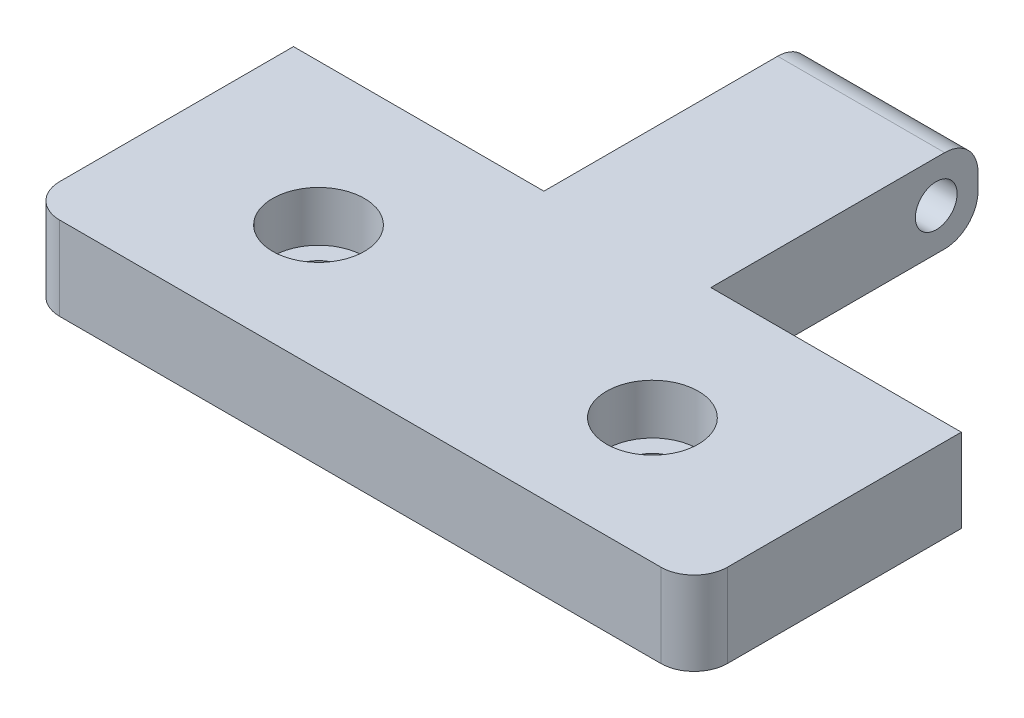
ISO-10303-21;
HEADER;
FILE_DESCRIPTION(('STEP AP214'),'2;1');
FILE_NAME('part.step','',(''),(''),'','','');
FILE_SCHEMA(('AUTOMOTIVE_DESIGN { 1 0 10303 214 1 1 1 1 }'));
ENDSEC;
DATA;
#1=APPLICATION_CONTEXT('core data for automotive mechanical design processes');
#2=APPLICATION_PROTOCOL_DEFINITION('international standard','automotive_design',2000,#1);
#3=PRODUCT_CONTEXT('',#1,'mechanical');
#4=PRODUCT('Part','Part','',(#3));
#5=PRODUCT_RELATED_PRODUCT_CATEGORY('part','',(#4));
#6=PRODUCT_DEFINITION_FORMATION('','',#4);
#7=PRODUCT_DEFINITION_CONTEXT('part definition',#1,'design');
#8=PRODUCT_DEFINITION('design','',#6,#7);
#9=PRODUCT_DEFINITION_SHAPE('','',#8);
#10=(LENGTH_UNIT() NAMED_UNIT(*) SI_UNIT(.MILLI.,.METRE.));
#11=(NAMED_UNIT(*) PLANE_ANGLE_UNIT() SI_UNIT($,.RADIAN.));
#12=(NAMED_UNIT(*) SI_UNIT($,.STERADIAN.) SOLID_ANGLE_UNIT());
#13=UNCERTAINTY_MEASURE_WITH_UNIT(LENGTH_MEASURE(1.E-05),#10,'distance_accuracy_value','');
#14=(GEOMETRIC_REPRESENTATION_CONTEXT(3) GLOBAL_UNCERTAINTY_ASSIGNED_CONTEXT((#13)) GLOBAL_UNIT_ASSIGNED_CONTEXT((#10,
#11,#12)) REPRESENTATION_CONTEXT('',''));
#15=CARTESIAN_POINT('',(0.,0.,0.));
#16=DIRECTION('',(0.,0.,1.));
#17=DIRECTION('',(1.,0.,0.));
#18=AXIS2_PLACEMENT_3D('',#15,#16,#17);
#19=CARTESIAN_POINT('',(0.,10.,0.));
#20=DIRECTION('',(1.,0.,0.));
#21=DIRECTION('',(0.,0.,-1.));
#22=AXIS2_PLACEMENT_3D('',#19,#20,#21);
#23=PLANE('',#22);
#24=DIRECTION('',(0.,0.,1.));
#25=VECTOR('',#24,1.);
#26=CARTESIAN_POINT('',(0.,0.,0.));
#27=LINE('',#26,#25);
#28=CARTESIAN_POINT('',(0.,0.,-32.));
#29=VERTEX_POINT('',#28);
#30=CARTESIAN_POINT('',(0.,0.,-4.));
#31=VERTEX_POINT('',#30);
#32=EDGE_CURVE('E164',#29,#31,#27,.T.);
#33=ORIENTED_EDGE('',*,*,#32,.T.);
#34=DIRECTION('',(0.,-1.,0.));
#35=VECTOR('',#34,1.);
#36=CARTESIAN_POINT('',(0.,10.,-4.));
#37=LINE('',#36,#35);
#38=CARTESIAN_POINT('',(0.,10.,-4.));
#39=VERTEX_POINT('',#38);
#40=EDGE_CURVE('E64',#31,#39,#37,.F.);
#41=ORIENTED_EDGE('',*,*,#40,.T.);
#42=DIRECTION('',(0.,0.,1.));
#43=VECTOR('',#42,1.);
#44=CARTESIAN_POINT('',(0.,10.,0.));
#45=LINE('',#44,#43);
#46=CARTESIAN_POINT('',(0.,10.,-32.));
#47=VERTEX_POINT('',#46);
#48=EDGE_CURVE('E180',#47,#39,#45,.T.);
#49=ORIENTED_EDGE('',*,*,#48,.F.);
#50=DIRECTION('',(0.,-1.,0.));
#51=VECTOR('',#50,1.);
#52=CARTESIAN_POINT('',(0.,10.,-32.));
#53=LINE('',#52,#51);
#54=EDGE_CURVE('E163',#47,#29,#53,.T.);
#55=ORIENTED_EDGE('',*,*,#54,.T.);
#56=EDGE_LOOP('',(#33,#41,#49,#55));
#57=FACE_BOUND('',#56,.T.);
#58=ADVANCED_FACE('F41',(#57),#23,.F.);
#59=CARTESIAN_POINT('',(0.,10.,0.));
#60=DIRECTION('',(0.,0.,-1.));
#61=DIRECTION('',(-1.,0.,0.));
#62=AXIS2_PLACEMENT_3D('',#59,#60,#61);
#63=PLANE('',#62);
#64=DIRECTION('',(1.,0.,0.));
#65=VECTOR('',#64,1.);
#66=CARTESIAN_POINT('',(0.,10.,0.));
#67=LINE('',#66,#65);
#68=CARTESIAN_POINT('',(4.,10.,0.));
#69=VERTEX_POINT('',#68);
#70=CARTESIAN_POINT('',(76.,10.,0.));
#71=VERTEX_POINT('',#70);
#72=EDGE_CURVE('E139',#69,#71,#67,.T.);
#73=ORIENTED_EDGE('',*,*,#72,.F.);
#74=DIRECTION('',(0.,-1.,0.));
#75=VECTOR('',#74,1.);
#76=CARTESIAN_POINT('',(4.,10.,0.));
#77=LINE('',#76,#75);
#78=CARTESIAN_POINT('',(4.,0.,0.));
#79=VERTEX_POINT('',#78);
#80=EDGE_CURVE('E215',#69,#79,#77,.T.);
#81=ORIENTED_EDGE('',*,*,#80,.T.);
#82=DIRECTION('',(1.,0.,0.));
#83=VECTOR('',#82,1.);
#84=CARTESIAN_POINT('',(0.,0.,0.));
#85=LINE('',#84,#83);
#86=CARTESIAN_POINT('',(76.,0.,0.));
#87=VERTEX_POINT('',#86);
#88=EDGE_CURVE('E166',#79,#87,#85,.T.);
#89=ORIENTED_EDGE('',*,*,#88,.T.);
#90=DIRECTION('',(0.,-1.,0.));
#91=VECTOR('',#90,1.);
#92=CARTESIAN_POINT('',(76.,10.,0.));
#93=LINE('',#92,#91);
#94=EDGE_CURVE('E210',#87,#71,#93,.F.);
#95=ORIENTED_EDGE('',*,*,#94,.T.);
#96=EDGE_LOOP('',(#73,#81,#89,#95));
#97=FACE_BOUND('',#96,.T.);
#98=ADVANCED_FACE('F228',(#97),#63,.F.);
#99=CARTESIAN_POINT('',(80.,10.,0.));
#100=DIRECTION('',(-1.,0.,0.));
#101=DIRECTION('',(0.,0.,1.));
#102=AXIS2_PLACEMENT_3D('',#99,#100,#101);
#103=PLANE('',#102);
#104=DIRECTION('',(0.,0.,-1.));
#105=VECTOR('',#104,1.);
#106=CARTESIAN_POINT('',(80.,10.,0.));
#107=LINE('',#106,#105);
#108=CARTESIAN_POINT('',(80.,10.,-4.));
#109=VERTEX_POINT('',#108);
#110=CARTESIAN_POINT('',(80.,10.,-32.));
#111=VERTEX_POINT('',#110);
#112=EDGE_CURVE('E130',#109,#111,#107,.T.);
#113=ORIENTED_EDGE('',*,*,#112,.F.);
#114=DIRECTION('',(0.,-1.,0.));
#115=VECTOR('',#114,1.);
#116=CARTESIAN_POINT('',(80.,10.,-4.));
#117=LINE('',#116,#115);
#118=CARTESIAN_POINT('',(80.,0.,-4.));
#119=VERTEX_POINT('',#118);
#120=EDGE_CURVE('E11',#109,#119,#117,.T.);
#121=ORIENTED_EDGE('',*,*,#120,.T.);
#122=DIRECTION('',(0.,0.,-1.));
#123=VECTOR('',#122,1.);
#124=CARTESIAN_POINT('',(80.,0.,0.));
#125=LINE('',#124,#123);
#126=CARTESIAN_POINT('',(80.,0.,-32.));
#127=VERTEX_POINT('',#126);
#128=EDGE_CURVE('E145',#119,#127,#125,.T.);
#129=ORIENTED_EDGE('',*,*,#128,.T.);
#130=DIRECTION('',(0.,-1.,0.));
#131=VECTOR('',#130,1.);
#132=CARTESIAN_POINT('',(80.,10.,-32.));
#133=LINE('',#132,#131);
#134=EDGE_CURVE('E142',#111,#127,#133,.T.);
#135=ORIENTED_EDGE('',*,*,#134,.F.);
#136=EDGE_LOOP('',(#113,#121,#129,#135));
#137=FACE_BOUND('',#136,.T.);
#138=ADVANCED_FACE('F143',(#137),#103,.F.);
#139=CARTESIAN_POINT('',(50.,10.,-32.));
#140=DIRECTION('',(0.,0.,1.));
#141=DIRECTION('',(1.,0.,0.));
#142=AXIS2_PLACEMENT_3D('',#139,#140,#141);
#143=PLANE('',#142);
#144=DIRECTION('',(-1.,0.,0.));
#145=VECTOR('',#144,1.);
#146=CARTESIAN_POINT('',(50.,0.,-32.));
#147=LINE('',#146,#145);
#148=CARTESIAN_POINT('',(50.,0.,-32.));
#149=VERTEX_POINT('',#148);
#150=EDGE_CURVE('E171',#127,#149,#147,.T.);
#151=ORIENTED_EDGE('',*,*,#150,.T.);
#152=DIRECTION('',(0.,-1.,0.));
#153=VECTOR('',#152,1.);
#154=CARTESIAN_POINT('',(50.,10.,-32.));
#155=LINE('',#154,#153);
#156=CARTESIAN_POINT('',(50.,10.,-32.));
#157=VERTEX_POINT('',#156);
#158=EDGE_CURVE('E149',#157,#149,#155,.T.);
#159=ORIENTED_EDGE('',*,*,#158,.F.);
#160=DIRECTION('',(-1.,0.,0.));
#161=VECTOR('',#160,1.);
#162=CARTESIAN_POINT('',(50.,10.,-32.));
#163=LINE('',#162,#161);
#164=EDGE_CURVE('E135',#111,#157,#163,.T.);
#165=ORIENTED_EDGE('',*,*,#164,.F.);
#166=ORIENTED_EDGE('',*,*,#134,.T.);
#167=EDGE_LOOP('',(#151,#159,#165,#166));
#168=FACE_BOUND('',#167,.T.);
#169=ADVANCED_FACE('F151',(#168),#143,.F.);
#170=CARTESIAN_POINT('',(50.,10.,-32.));
#171=DIRECTION('',(-1.,0.,0.));
#172=DIRECTION('',(0.,0.,1.));
#173=AXIS2_PLACEMENT_3D('',#170,#171,#172);
#174=PLANE('',#173);
#175=CARTESIAN_POINT('',(50.,5.,-59.));
#176=DIRECTION('',(1.,0.,0.));
#177=DIRECTION('',(0.,0.,-1.));
#178=AXIS2_PLACEMENT_3D('',#175,#176,#177);
#179=CIRCLE('',#178,2.5);
#180=CARTESIAN_POINT('',(50.,5.,-61.5));
#181=VERTEX_POINT('',#180);
#182=EDGE_CURVE('E213',#181,#181,#179,.T.);
#183=ORIENTED_EDGE('',*,*,#182,.F.);
#184=EDGE_LOOP('',(#183));
#185=FACE_BOUND('',#184,.T.);
#186=DIRECTION('',(0.,0.,-1.));
#187=VECTOR('',#186,1.);
#188=CARTESIAN_POINT('',(50.,0.,-32.));
#189=LINE('',#188,#187);
#190=CARTESIAN_POINT('',(50.,0.,-60.));
#191=VERTEX_POINT('',#190);
#192=EDGE_CURVE('E173',#149,#191,#189,.T.);
#193=ORIENTED_EDGE('',*,*,#192,.T.);
#194=CARTESIAN_POINT('',(50.,4.,-60.));
#195=DIRECTION('',(-1.,0.,0.));
#196=DIRECTION('',(0.,0.,1.));
#197=AXIS2_PLACEMENT_3D('',#194,#195,#196);
#198=CIRCLE('',#197,4.);
#199=CARTESIAN_POINT('',(50.,4.,-64.));
#200=VERTEX_POINT('',#199);
#201=EDGE_CURVE('E205',#191,#200,#198,.F.);
#202=ORIENTED_EDGE('',*,*,#201,.T.);
#203=DIRECTION('',(0.,-1.,0.));
#204=VECTOR('',#203,1.);
#205=CARTESIAN_POINT('',(50.,10.,-64.));
#206=LINE('',#205,#204);
#207=CARTESIAN_POINT('',(50.,6.,-64.));
#208=VERTEX_POINT('',#207);
#209=EDGE_CURVE('E189',#208,#200,#206,.T.);
#210=ORIENTED_EDGE('',*,*,#209,.F.);
#211=CARTESIAN_POINT('',(50.,6.,-60.));
#212=DIRECTION('',(-1.,0.,0.));
#213=DIRECTION('',(0.,0.,1.));
#214=AXIS2_PLACEMENT_3D('',#211,#212,#213);
#215=CIRCLE('',#214,4.);
#216=CARTESIAN_POINT('',(50.,10.,-60.));
#217=VERTEX_POINT('',#216);
#218=EDGE_CURVE('E203',#208,#217,#215,.F.);
#219=ORIENTED_EDGE('',*,*,#218,.T.);
#220=DIRECTION('',(0.,0.,-1.));
#221=VECTOR('',#220,1.);
#222=CARTESIAN_POINT('',(50.,10.,-32.));
#223=LINE('',#222,#221);
#224=EDGE_CURVE('E154',#157,#217,#223,.T.);
#225=ORIENTED_EDGE('',*,*,#224,.F.);
#226=ORIENTED_EDGE('',*,*,#158,.T.);
#227=EDGE_LOOP('',(#193,#202,#210,#219,#225,#226));
#228=FACE_BOUND('',#227,.T.);
#229=ADVANCED_FACE('F251',(#185,#228),#174,.F.);
#230=CARTESIAN_POINT('',(30.,10.,-64.));
#231=DIRECTION('',(0.,0.,1.));
#232=DIRECTION('',(1.,0.,0.));
#233=AXIS2_PLACEMENT_3D('',#230,#231,#232);
#234=PLANE('',#233);
#235=ORIENTED_EDGE('',*,*,#209,.T.);
#236=DIRECTION('',(-1.,0.,0.));
#237=VECTOR('',#236,1.);
#238=CARTESIAN_POINT('',(30.,4.,-64.));
#239=LINE('',#238,#237);
#240=CARTESIAN_POINT('',(30.,4.,-64.));
#241=VERTEX_POINT('',#240);
#242=EDGE_CURVE('E194',#200,#241,#239,.T.);
#243=ORIENTED_EDGE('',*,*,#242,.T.);
#244=DIRECTION('',(0.,-1.,0.));
#245=VECTOR('',#244,1.);
#246=CARTESIAN_POINT('',(30.,10.,-64.));
#247=LINE('',#246,#245);
#248=CARTESIAN_POINT('',(30.,6.,-64.));
#249=VERTEX_POINT('',#248);
#250=EDGE_CURVE('E186',#249,#241,#247,.T.);
#251=ORIENTED_EDGE('',*,*,#250,.F.);
#252=DIRECTION('',(-1.,0.,0.));
#253=VECTOR('',#252,1.);
#254=CARTESIAN_POINT('',(30.,6.,-64.));
#255=LINE('',#254,#253);
#256=EDGE_CURVE('E148',#249,#208,#255,.F.);
#257=ORIENTED_EDGE('',*,*,#256,.T.);
#258=EDGE_LOOP('',(#235,#243,#251,#257));
#259=FACE_BOUND('',#258,.T.);
#260=ADVANCED_FACE('F254',(#259),#234,.F.);
#261=CARTESIAN_POINT('',(30.,10.,-32.));
#262=DIRECTION('',(1.,0.,0.));
#263=DIRECTION('',(0.,0.,-1.));
#264=AXIS2_PLACEMENT_3D('',#261,#262,#263);
#265=PLANE('',#264);
#266=CARTESIAN_POINT('',(30.,5.,-59.));
#267=DIRECTION('',(1.,0.,0.));
#268=DIRECTION('',(0.,0.,-1.));
#269=AXIS2_PLACEMENT_3D('',#266,#267,#268);
#270=CIRCLE('',#269,2.5);
#271=CARTESIAN_POINT('',(30.,5.,-61.5));
#272=VERTEX_POINT('',#271);
#273=EDGE_CURVE('E167',#272,#272,#270,.T.);
#274=ORIENTED_EDGE('',*,*,#273,.T.);
#275=EDGE_LOOP('',(#274));
#276=FACE_BOUND('',#275,.T.);
#277=ORIENTED_EDGE('',*,*,#250,.T.);
#278=CARTESIAN_POINT('',(30.,4.,-60.));
#279=DIRECTION('',(1.,0.,0.));
#280=DIRECTION('',(0.,0.,-1.));
#281=AXIS2_PLACEMENT_3D('',#278,#279,#280);
#282=CIRCLE('',#281,4.);
#283=CARTESIAN_POINT('',(30.,0.,-60.));
#284=VERTEX_POINT('',#283);
#285=EDGE_CURVE('E199',#241,#284,#282,.F.);
#286=ORIENTED_EDGE('',*,*,#285,.T.);
#287=DIRECTION('',(0.,0.,1.));
#288=VECTOR('',#287,1.);
#289=CARTESIAN_POINT('',(30.,0.,-32.));
#290=LINE('',#289,#288);
#291=CARTESIAN_POINT('',(30.,0.,-32.));
#292=VERTEX_POINT('',#291);
#293=EDGE_CURVE('E176',#284,#292,#290,.T.);
#294=ORIENTED_EDGE('',*,*,#293,.T.);
#295=DIRECTION('',(0.,-1.,0.));
#296=VECTOR('',#295,1.);
#297=CARTESIAN_POINT('',(30.,10.,-32.));
#298=LINE('',#297,#296);
#299=CARTESIAN_POINT('',(30.,10.,-32.));
#300=VERTEX_POINT('',#299);
#301=EDGE_CURVE('E183',#300,#292,#298,.T.);
#302=ORIENTED_EDGE('',*,*,#301,.F.);
#303=DIRECTION('',(0.,0.,1.));
#304=VECTOR('',#303,1.);
#305=CARTESIAN_POINT('',(30.,10.,-32.));
#306=LINE('',#305,#304);
#307=CARTESIAN_POINT('',(30.,10.,-60.));
#308=VERTEX_POINT('',#307);
#309=EDGE_CURVE('E156',#308,#300,#306,.T.);
#310=ORIENTED_EDGE('',*,*,#309,.F.);
#311=CARTESIAN_POINT('',(30.,6.,-60.));
#312=DIRECTION('',(1.,0.,0.));
#313=DIRECTION('',(0.,0.,-1.));
#314=AXIS2_PLACEMENT_3D('',#311,#312,#313);
#315=CIRCLE('',#314,4.);
#316=EDGE_CURVE('E197',#308,#249,#315,.F.);
#317=ORIENTED_EDGE('',*,*,#316,.T.);
#318=EDGE_LOOP('',(#277,#286,#294,#302,#310,#317));
#319=FACE_BOUND('',#318,.T.);
#320=ADVANCED_FACE('F261',(#276,#319),#265,.F.);
#321=CARTESIAN_POINT('',(0.,10.,-32.));
#322=DIRECTION('',(0.,0.,1.));
#323=DIRECTION('',(1.,0.,0.));
#324=AXIS2_PLACEMENT_3D('',#321,#322,#323);
#325=PLANE('',#324);
#326=DIRECTION('',(-1.,0.,0.));
#327=VECTOR('',#326,1.);
#328=CARTESIAN_POINT('',(0.,0.,-32.));
#329=LINE('',#328,#327);
#330=EDGE_CURVE('E178',#292,#29,#329,.T.);
#331=ORIENTED_EDGE('',*,*,#330,.T.);
#332=ORIENTED_EDGE('',*,*,#54,.F.);
#333=DIRECTION('',(-1.,0.,0.));
#334=VECTOR('',#333,1.);
#335=CARTESIAN_POINT('',(0.,10.,-32.));
#336=LINE('',#335,#334);
#337=EDGE_CURVE('E161',#300,#47,#336,.T.);
#338=ORIENTED_EDGE('',*,*,#337,.F.);
#339=ORIENTED_EDGE('',*,*,#301,.T.);
#340=EDGE_LOOP('',(#331,#332,#338,#339));
#341=FACE_BOUND('',#340,.T.);
#342=ADVANCED_FACE('F239',(#341),#325,.F.);
#343=CARTESIAN_POINT('',(0.,10.,0.));
#344=DIRECTION('',(0.,-1.,0.));
#345=DIRECTION('',(0.,0.,-1.));
#346=AXIS2_PLACEMENT_3D('',#343,#344,#345);
#347=PLANE('',#346);
#348=CARTESIAN_POINT('',(20.,10.,-15.));
#349=DIRECTION('',(0.,1.,0.));
#350=DIRECTION('',(0.,0.,1.));
#351=AXIS2_PLACEMENT_3D('',#348,#349,#350);
#352=CIRCLE('',#351,5.5);
#353=CARTESIAN_POINT('',(20.,10.,-9.5));
#354=VERTEX_POINT('',#353);
#355=EDGE_CURVE('E329',#354,#354,#352,.T.);
#356=ORIENTED_EDGE('',*,*,#355,.F.);
#357=EDGE_LOOP('',(#356));
#358=FACE_BOUND('',#357,.T.);
#359=CARTESIAN_POINT('',(60.,10.,-15.));
#360=DIRECTION('',(0.,1.,0.));
#361=DIRECTION('',(0.,0.,1.));
#362=AXIS2_PLACEMENT_3D('',#359,#360,#361);
#363=CIRCLE('',#362,5.5);
#364=CARTESIAN_POINT('',(60.,10.,-9.5));
#365=VERTEX_POINT('',#364);
#366=EDGE_CURVE('E332',#365,#365,#363,.T.);
#367=ORIENTED_EDGE('',*,*,#366,.F.);
#368=EDGE_LOOP('',(#367));
#369=FACE_BOUND('',#368,.T.);
#370=ORIENTED_EDGE('',*,*,#48,.T.);
#371=CARTESIAN_POINT('',(4.,10.,-4.));
#372=DIRECTION('',(0.,-1.,0.));
#373=DIRECTION('',(0.,0.,-1.));
#374=AXIS2_PLACEMENT_3D('',#371,#372,#373);
#375=CIRCLE('',#374,4.);
#376=EDGE_CURVE('E49',#39,#69,#375,.F.);
#377=ORIENTED_EDGE('',*,*,#376,.T.);
#378=ORIENTED_EDGE('',*,*,#72,.T.);
#379=CARTESIAN_POINT('',(76.,10.,-4.));
#380=DIRECTION('',(0.,-1.,0.));
#381=DIRECTION('',(0.,0.,-1.));
#382=AXIS2_PLACEMENT_3D('',#379,#380,#381);
#383=CIRCLE('',#382,4.);
#384=EDGE_CURVE('E56',#71,#109,#383,.F.);
#385=ORIENTED_EDGE('',*,*,#384,.T.);
#386=ORIENTED_EDGE('',*,*,#112,.T.);
#387=ORIENTED_EDGE('',*,*,#164,.T.);
#388=ORIENTED_EDGE('',*,*,#224,.T.);
#389=DIRECTION('',(-1.,0.,0.));
#390=VECTOR('',#389,1.);
#391=CARTESIAN_POINT('',(0.,10.,-60.));
#392=LINE('',#391,#390);
#393=EDGE_CURVE('E207',#217,#308,#392,.T.);
#394=ORIENTED_EDGE('',*,*,#393,.T.);
#395=ORIENTED_EDGE('',*,*,#309,.T.);
#396=ORIENTED_EDGE('',*,*,#337,.T.);
#397=EDGE_LOOP('',(#370,#377,#378,#385,#386,#387,#388,#394,#395,#396));
#398=FACE_BOUND('',#397,.T.);
#399=ADVANCED_FACE('F132',(#358,#369,#398),#347,.F.);
#400=CARTESIAN_POINT('',(0.,0.,0.));
#401=DIRECTION('',(0.,-1.,0.));
#402=DIRECTION('',(0.,0.,-1.));
#403=AXIS2_PLACEMENT_3D('',#400,#401,#402);
#404=PLANE('',#403);
#405=CARTESIAN_POINT('',(20.,0.,-15.));
#406=DIRECTION('',(0.,1.,0.));
#407=DIRECTION('',(0.,0.,1.));
#408=AXIS2_PLACEMENT_3D('',#405,#406,#407);
#409=CIRCLE('',#408,3.25);
#410=CARTESIAN_POINT('',(20.,0.,-11.75));
#411=VERTEX_POINT('',#410);
#412=EDGE_CURVE('E314',#411,#411,#409,.T.);
#413=ORIENTED_EDGE('',*,*,#412,.T.);
#414=EDGE_LOOP('',(#413));
#415=FACE_BOUND('',#414,.T.);
#416=CARTESIAN_POINT('',(60.,0.,-15.));
#417=DIRECTION('',(0.,1.,0.));
#418=DIRECTION('',(0.,0.,1.));
#419=AXIS2_PLACEMENT_3D('',#416,#417,#418);
#420=CIRCLE('',#419,3.25000000000001);
#421=CARTESIAN_POINT('',(60.,0.,-11.75));
#422=VERTEX_POINT('',#421);
#423=EDGE_CURVE('E317',#422,#422,#420,.T.);
#424=ORIENTED_EDGE('',*,*,#423,.T.);
#425=EDGE_LOOP('',(#424));
#426=FACE_BOUND('',#425,.T.);
#427=ORIENTED_EDGE('',*,*,#88,.F.);
#428=CARTESIAN_POINT('',(4.,0.,-4.));
#429=DIRECTION('',(0.,-1.,0.));
#430=DIRECTION('',(0.,0.,-1.));
#431=AXIS2_PLACEMENT_3D('',#428,#429,#430);
#432=CIRCLE('',#431,4.);
#433=EDGE_CURVE('E220',#79,#31,#432,.T.);
#434=ORIENTED_EDGE('',*,*,#433,.T.);
#435=ORIENTED_EDGE('',*,*,#32,.F.);
#436=ORIENTED_EDGE('',*,*,#330,.F.);
#437=ORIENTED_EDGE('',*,*,#293,.F.);
#438=DIRECTION('',(-1.,0.,0.));
#439=VECTOR('',#438,1.);
#440=CARTESIAN_POINT('',(50.,0.,-60.));
#441=LINE('',#440,#439);
#442=EDGE_CURVE('E201',#284,#191,#441,.F.);
#443=ORIENTED_EDGE('',*,*,#442,.T.);
#444=ORIENTED_EDGE('',*,*,#192,.F.);
#445=ORIENTED_EDGE('',*,*,#150,.F.);
#446=ORIENTED_EDGE('',*,*,#128,.F.);
#447=CARTESIAN_POINT('',(76.,0.,-4.));
#448=DIRECTION('',(0.,-1.,0.));
#449=DIRECTION('',(0.,0.,-1.));
#450=AXIS2_PLACEMENT_3D('',#447,#448,#449);
#451=CIRCLE('',#450,4.);
#452=EDGE_CURVE('E218',#119,#87,#451,.T.);
#453=ORIENTED_EDGE('',*,*,#452,.T.);
#454=EDGE_LOOP('',(#427,#434,#435,#436,#437,#443,#444,#445,#446,#453));
#455=FACE_BOUND('',#454,.T.);
#456=ADVANCED_FACE('F234',(#415,#426,#455),#404,.T.);
#457=CARTESIAN_POINT('',(30.,4.,-60.));
#458=DIRECTION('',(1.,0.,0.));
#459=DIRECTION('',(0.,0.,-1.));
#460=AXIS2_PLACEMENT_3D('',#457,#458,#459);
#461=CYLINDRICAL_SURFACE('',#460,4.);
#462=ORIENTED_EDGE('',*,*,#201,.F.);
#463=ORIENTED_EDGE('',*,*,#442,.F.);
#464=ORIENTED_EDGE('',*,*,#285,.F.);
#465=ORIENTED_EDGE('',*,*,#242,.F.);
#466=EDGE_LOOP('',(#462,#463,#464,#465));
#467=FACE_BOUND('',#466,.T.);
#468=ADVANCED_FACE('F247',(#467),#461,.T.);
#469=CARTESIAN_POINT('',(0.,6.,-60.));
#470=DIRECTION('',(-1.,0.,0.));
#471=DIRECTION('',(0.,0.,1.));
#472=AXIS2_PLACEMENT_3D('',#469,#470,#471);
#473=CYLINDRICAL_SURFACE('',#472,4.);
#474=ORIENTED_EDGE('',*,*,#218,.F.);
#475=ORIENTED_EDGE('',*,*,#256,.F.);
#476=ORIENTED_EDGE('',*,*,#316,.F.);
#477=ORIENTED_EDGE('',*,*,#393,.F.);
#478=EDGE_LOOP('',(#474,#475,#476,#477));
#479=FACE_BOUND('',#478,.T.);
#480=ADVANCED_FACE('F258',(#479),#473,.T.);
#481=CARTESIAN_POINT('',(0.,5.,-59.));
#482=DIRECTION('',(1.,0.,0.));
#483=DIRECTION('',(0.,0.,-1.));
#484=AXIS2_PLACEMENT_3D('',#481,#482,#483);
#485=CYLINDRICAL_SURFACE('',#484,2.5);
#486=ORIENTED_EDGE('',*,*,#182,.T.);
#487=EDGE_LOOP('',(#486));
#488=FACE_BOUND('',#487,.T.);
#489=ORIENTED_EDGE('',*,*,#273,.F.);
#490=EDGE_LOOP('',(#489));
#491=FACE_BOUND('',#490,.T.);
#492=ADVANCED_FACE('F284',(#488,#491),#485,.F.);
#493=CARTESIAN_POINT('',(4.,10.,-4.));
#494=DIRECTION('',(0.,-1.,0.));
#495=DIRECTION('',(0.,0.,-1.));
#496=AXIS2_PLACEMENT_3D('',#493,#494,#495);
#497=CYLINDRICAL_SURFACE('',#496,4.);
#498=ORIENTED_EDGE('',*,*,#376,.F.);
#499=ORIENTED_EDGE('',*,*,#40,.F.);
#500=ORIENTED_EDGE('',*,*,#433,.F.);
#501=ORIENTED_EDGE('',*,*,#80,.F.);
#502=EDGE_LOOP('',(#498,#499,#500,#501));
#503=FACE_BOUND('',#502,.T.);
#504=ADVANCED_FACE('F231',(#503),#497,.T.);
#505=CARTESIAN_POINT('',(76.,10.,-4.));
#506=DIRECTION('',(0.,-1.,0.));
#507=DIRECTION('',(0.,0.,-1.));
#508=AXIS2_PLACEMENT_3D('',#505,#506,#507);
#509=CYLINDRICAL_SURFACE('',#508,4.);
#510=ORIENTED_EDGE('',*,*,#384,.F.);
#511=ORIENTED_EDGE('',*,*,#94,.F.);
#512=ORIENTED_EDGE('',*,*,#452,.F.);
#513=ORIENTED_EDGE('',*,*,#120,.F.);
#514=EDGE_LOOP('',(#510,#511,#512,#513));
#515=FACE_BOUND('',#514,.T.);
#516=ADVANCED_FACE('F43',(#515),#509,.T.);
#517=CARTESIAN_POINT('',(60.,4.,-15.));
#518=DIRECTION('',(0.,1.,0.));
#519=DIRECTION('',(0.,0.,1.));
#520=AXIS2_PLACEMENT_3D('',#517,#518,#519);
#521=CYLINDRICAL_SURFACE('',#520,5.5);
#522=CARTESIAN_POINT('',(60.,4.,-15.));
#523=DIRECTION('',(0.,1.,0.));
#524=DIRECTION('',(0.,0.,1.));
#525=AXIS2_PLACEMENT_3D('',#522,#523,#524);
#526=CIRCLE('',#525,5.5);
#527=CARTESIAN_POINT('',(60.,4.,-9.5));
#528=VERTEX_POINT('',#527);
#529=EDGE_CURVE('E335',#528,#528,#526,.T.);
#530=ORIENTED_EDGE('',*,*,#529,.F.);
#531=EDGE_LOOP('',(#530));
#532=FACE_BOUND('',#531,.T.);
#533=ORIENTED_EDGE('',*,*,#366,.T.);
#534=EDGE_LOOP('',(#533));
#535=FACE_BOUND('',#534,.T.);
#536=ADVANCED_FACE('F290',(#532,#535),#521,.F.);
#537=CARTESIAN_POINT('',(60.,4.,-15.));
#538=DIRECTION('',(0.,1.,0.));
#539=DIRECTION('',(0.,0.,1.));
#540=AXIS2_PLACEMENT_3D('',#537,#538,#539);
#541=PLANE('',#540);
#542=CARTESIAN_POINT('',(60.,4.,-15.));
#543=DIRECTION('',(0.,1.,0.));
#544=DIRECTION('',(0.,0.,1.));
#545=AXIS2_PLACEMENT_3D('',#542,#543,#544);
#546=CIRCLE('',#545,3.25000000000001);
#547=CARTESIAN_POINT('',(60.,4.,-11.75));
#548=VERTEX_POINT('',#547);
#549=EDGE_CURVE('E319',#548,#548,#546,.T.);
#550=ORIENTED_EDGE('',*,*,#549,.F.);
#551=EDGE_LOOP('',(#550));
#552=FACE_BOUND('',#551,.T.);
#553=ORIENTED_EDGE('',*,*,#529,.T.);
#554=EDGE_LOOP('',(#553));
#555=FACE_BOUND('',#554,.T.);
#556=ADVANCED_FACE('F300',(#552,#555),#541,.T.);
#557=CARTESIAN_POINT('',(20.,4.,-15.));
#558=DIRECTION('',(0.,1.,0.));
#559=DIRECTION('',(0.,0.,1.));
#560=AXIS2_PLACEMENT_3D('',#557,#558,#559);
#561=CYLINDRICAL_SURFACE('',#560,5.5);
#562=CARTESIAN_POINT('',(20.,4.,-15.));
#563=DIRECTION('',(0.,1.,0.));
#564=DIRECTION('',(0.,0.,1.));
#565=AXIS2_PLACEMENT_3D('',#562,#563,#564);
#566=CIRCLE('',#565,5.5);
#567=CARTESIAN_POINT('',(20.,4.,-9.5));
#568=VERTEX_POINT('',#567);
#569=EDGE_CURVE('E326',#568,#568,#566,.T.);
#570=ORIENTED_EDGE('',*,*,#569,.F.);
#571=EDGE_LOOP('',(#570));
#572=FACE_BOUND('',#571,.T.);
#573=ORIENTED_EDGE('',*,*,#355,.T.);
#574=EDGE_LOOP('',(#573));
#575=FACE_BOUND('',#574,.T.);
#576=ADVANCED_FACE('F428',(#572,#575),#561,.F.);
#577=CARTESIAN_POINT('',(20.,4.,-15.));
#578=DIRECTION('',(0.,1.,0.));
#579=DIRECTION('',(0.,0.,1.));
#580=AXIS2_PLACEMENT_3D('',#577,#578,#579);
#581=PLANE('',#580);
#582=CARTESIAN_POINT('',(20.,4.,-15.));
#583=DIRECTION('',(0.,1.,0.));
#584=DIRECTION('',(0.,0.,1.));
#585=AXIS2_PLACEMENT_3D('',#582,#583,#584);
#586=CIRCLE('',#585,3.25);
#587=CARTESIAN_POINT('',(20.,4.,-11.75));
#588=VERTEX_POINT('',#587);
#589=EDGE_CURVE('E322',#588,#588,#586,.T.);
#590=ORIENTED_EDGE('',*,*,#589,.F.);
#591=EDGE_LOOP('',(#590));
#592=FACE_BOUND('',#591,.T.);
#593=ORIENTED_EDGE('',*,*,#569,.T.);
#594=EDGE_LOOP('',(#593));
#595=FACE_BOUND('',#594,.T.);
#596=ADVANCED_FACE('F435',(#592,#595),#581,.T.);
#597=CARTESIAN_POINT('',(60.,0.,-15.));
#598=DIRECTION('',(0.,1.,0.));
#599=DIRECTION('',(0.,0.,1.));
#600=AXIS2_PLACEMENT_3D('',#597,#598,#599);
#601=CYLINDRICAL_SURFACE('',#600,3.25000000000001);
#602=ORIENTED_EDGE('',*,*,#423,.F.);
#603=EDGE_LOOP('',(#602));
#604=FACE_BOUND('',#603,.T.);
#605=ORIENTED_EDGE('',*,*,#549,.T.);
#606=EDGE_LOOP('',(#605));
#607=FACE_BOUND('',#606,.T.);
#608=ADVANCED_FACE('F444',(#604,#607),#601,.F.);
#609=CARTESIAN_POINT('',(20.,0.,-15.));
#610=DIRECTION('',(0.,1.,0.));
#611=DIRECTION('',(0.,0.,1.));
#612=AXIS2_PLACEMENT_3D('',#609,#610,#611);
#613=CYLINDRICAL_SURFACE('',#612,3.25);
#614=ORIENTED_EDGE('',*,*,#412,.F.);
#615=EDGE_LOOP('',(#614));
#616=FACE_BOUND('',#615,.T.);
#617=ORIENTED_EDGE('',*,*,#589,.T.);
#618=EDGE_LOOP('',(#617));
#619=FACE_BOUND('',#618,.T.);
#620=ADVANCED_FACE('F453',(#616,#619),#613,.F.);
#621=CLOSED_SHELL('',(#58,#98,#138,#169,#229,#260,#320,#342,#399,#456,#468,#480,#492,#504,#516,
#536,#556,#576,#596,#608,#620));
#622=MANIFOLD_SOLID_BREP('B2',#621);
#623=ADVANCED_BREP_SHAPE_REPRESENTATION('',(#18,#622),#14);
#624=SHAPE_DEFINITION_REPRESENTATION(#9,#623);
ENDSEC;
END-ISO-10303-21;
